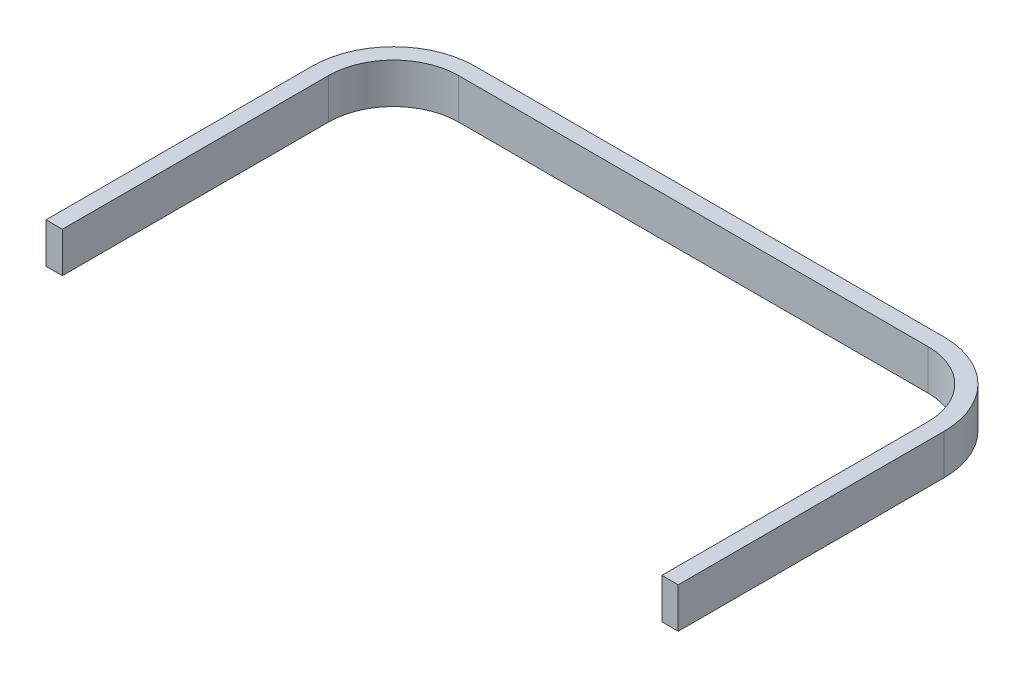
ISO-10303-21;
HEADER;
FILE_DESCRIPTION(('STEP AP214'),'2;1');
FILE_NAME('part.step','',(''),(''),'','','');
FILE_SCHEMA(('AUTOMOTIVE_DESIGN { 1 0 10303 214 1 1 1 1 }'));
ENDSEC;
DATA;
#1=APPLICATION_CONTEXT('core data for automotive mechanical design processes');
#2=APPLICATION_PROTOCOL_DEFINITION('international standard','automotive_design',2000,#1);
#3=PRODUCT_CONTEXT('',#1,'mechanical');
#4=PRODUCT('Part','Part','',(#3));
#5=PRODUCT_RELATED_PRODUCT_CATEGORY('part','',(#4));
#6=PRODUCT_DEFINITION_FORMATION('','',#4);
#7=PRODUCT_DEFINITION_CONTEXT('part definition',#1,'design');
#8=PRODUCT_DEFINITION('design','',#6,#7);
#9=PRODUCT_DEFINITION_SHAPE('','',#8);
#10=(LENGTH_UNIT() NAMED_UNIT(*) SI_UNIT(.MILLI.,.METRE.));
#11=(NAMED_UNIT(*) PLANE_ANGLE_UNIT() SI_UNIT($,.RADIAN.));
#12=(NAMED_UNIT(*) SI_UNIT($,.STERADIAN.) SOLID_ANGLE_UNIT());
#13=UNCERTAINTY_MEASURE_WITH_UNIT(LENGTH_MEASURE(1.E-05),#10,'distance_accuracy_value','');
#14=(GEOMETRIC_REPRESENTATION_CONTEXT(3) GLOBAL_UNCERTAINTY_ASSIGNED_CONTEXT((#13)) GLOBAL_UNIT_ASSIGNED_CONTEXT((#10,
#11,#12)) REPRESENTATION_CONTEXT('',''));
#15=CARTESIAN_POINT('',(0.,0.,0.));
#16=DIRECTION('',(0.,0.,1.));
#17=DIRECTION('',(1.,0.,0.));
#18=AXIS2_PLACEMENT_3D('',#15,#16,#17);
#19=CARTESIAN_POINT('',(-609.599999999999,-52.3075773788979,-784.073141203804));
#20=DIRECTION('',(0.,0.,1.));
#21=DIRECTION('',(1.,0.,0.));
#22=AXIS2_PLACEMENT_3D('',#19,#20,#21);
#23=PLANE('',#22);
#24=DIRECTION('',(0.,-1.,0.));
#25=VECTOR('',#24,1.);
#26=CARTESIAN_POINT('',(-609.599999999999,-52.3075773788979,-784.073141203804));
#27=LINE('',#26,#25);
#28=CARTESIAN_POINT('',(-609.599999999999,52.3075773788979,-784.073141203804));
#29=VERTEX_POINT('',#28);
#30=CARTESIAN_POINT('',(-609.599999999999,-52.3075773788979,-784.073141203804));
#31=VERTEX_POINT('',#30);
#32=EDGE_CURVE('E201',#29,#31,#27,.T.);
#33=ORIENTED_EDGE('',*,*,#32,.F.);
#34=DIRECTION('',(1.,0.,0.));
#35=VECTOR('',#34,1.);
#36=CARTESIAN_POINT('',(-609.599999999999,52.3075773788979,-784.073141203804));
#37=LINE('',#36,#35);
#38=CARTESIAN_POINT('',(609.60000000002,52.3075773788979,-784.073141203787));
#39=VERTEX_POINT('',#38);
#40=EDGE_CURVE('E217',#29,#39,#37,.T.);
#41=ORIENTED_EDGE('',*,*,#40,.T.);
#42=DIRECTION('',(0.,-1.,0.));
#43=VECTOR('',#42,1.);
#44=CARTESIAN_POINT('',(609.60000000002,-52.3075773788979,-784.073141203787));
#45=LINE('',#44,#43);
#46=CARTESIAN_POINT('',(609.60000000002,-52.3075773788979,-784.073141203787));
#47=VERTEX_POINT('',#46);
#48=EDGE_CURVE('E129',#39,#47,#45,.T.);
#49=ORIENTED_EDGE('',*,*,#48,.T.);
#50=DIRECTION('',(1.,0.,0.));
#51=VECTOR('',#50,1.);
#52=CARTESIAN_POINT('',(-609.599999999999,-52.3075773788979,-784.073141203804));
#53=LINE('',#52,#51);
#54=EDGE_CURVE('E40',#31,#47,#53,.T.);
#55=ORIENTED_EDGE('',*,*,#54,.F.);
#56=EDGE_LOOP('',(#33,#41,#49,#55));
#57=FACE_BOUND('',#56,.T.);
#58=ADVANCED_FACE('F33',(#57),#23,.F.);
#59=CARTESIAN_POINT('',(-609.599999999999,-52.3075773788979,-741.62523745539));
#60=DIRECTION('',(0.,0.,-1.));
#61=DIRECTION('',(-1.,0.,0.));
#62=AXIS2_PLACEMENT_3D('',#59,#60,#61);
#63=PLANE('',#62);
#64=DIRECTION('',(0.,1.,0.));
#65=VECTOR('',#64,1.);
#66=CARTESIAN_POINT('',(-609.599999999999,-52.3075773788979,-741.62523745539));
#67=LINE('',#66,#65);
#68=CARTESIAN_POINT('',(-609.599999999999,-52.3075773788979,-741.62523745539));
#69=VERTEX_POINT('',#68);
#70=CARTESIAN_POINT('',(-609.599999999999,52.3075773788979,-741.62523745539));
#71=VERTEX_POINT('',#70);
#72=EDGE_CURVE('E193',#69,#71,#67,.T.);
#73=ORIENTED_EDGE('',*,*,#72,.F.);
#74=DIRECTION('',(1.,0.,0.));
#75=VECTOR('',#74,1.);
#76=CARTESIAN_POINT('',(-609.599999999999,-52.3075773788979,-741.62523745539));
#77=LINE('',#76,#75);
#78=CARTESIAN_POINT('',(609.60000000002,-52.3075773788979,-741.625237455373));
#79=VERTEX_POINT('',#78);
#80=EDGE_CURVE('E11',#69,#79,#77,.T.);
#81=ORIENTED_EDGE('',*,*,#80,.T.);
#82=DIRECTION('',(0.,1.,0.));
#83=VECTOR('',#82,1.);
#84=CARTESIAN_POINT('',(609.60000000002,-52.3075773788979,-741.625237455373));
#85=LINE('',#84,#83);
#86=CARTESIAN_POINT('',(609.60000000002,52.3075773788979,-741.625237455373));
#87=VERTEX_POINT('',#86);
#88=EDGE_CURVE('E127',#79,#87,#85,.T.);
#89=ORIENTED_EDGE('',*,*,#88,.T.);
#90=DIRECTION('',(1.,0.,0.));
#91=VECTOR('',#90,1.);
#92=CARTESIAN_POINT('',(-609.599999999999,52.3075773788979,-741.62523745539));
#93=LINE('',#92,#91);
#94=EDGE_CURVE('E215',#71,#87,#93,.T.);
#95=ORIENTED_EDGE('',*,*,#94,.F.);
#96=EDGE_LOOP('',(#73,#81,#89,#95));
#97=FACE_BOUND('',#96,.T.);
#98=ADVANCED_FACE('F235',(#97),#63,.F.);
#99=CARTESIAN_POINT('',(-609.6,0.,-572.349189329597));
#100=DIRECTION('',(0.,-1.,0.));
#101=DIRECTION('',(0.,0.,-1.));
#102=AXIS2_PLACEMENT_3D('',#99,#100,#101);
#103=CYLINDRICAL_SURFACE('',#102,211.723951874206);
#104=DIRECTION('',(0.,-1.,0.));
#105=VECTOR('',#104,1.);
#106=CARTESIAN_POINT('',(-821.323951874207,-52.3075773788979,-572.349189329596));
#107=LINE('',#106,#105);
#108=CARTESIAN_POINT('',(-821.323951874207,52.3075773788979,-572.349189329596));
#109=VERTEX_POINT('',#108);
#110=CARTESIAN_POINT('',(-821.323951874207,-52.3075773788979,-572.349189329596));
#111=VERTEX_POINT('',#110);
#112=EDGE_CURVE('E176',#109,#111,#107,.T.);
#113=ORIENTED_EDGE('',*,*,#112,.F.);
#114=CARTESIAN_POINT('',(-609.6,52.3075773788979,-572.349189329597));
#115=DIRECTION('',(0.,-1.,0.));
#116=DIRECTION('',(0.,0.,-1.));
#117=AXIS2_PLACEMENT_3D('',#114,#115,#116);
#118=CIRCLE('',#117,211.723951874206);
#119=EDGE_CURVE('E206',#109,#29,#118,.T.);
#120=ORIENTED_EDGE('',*,*,#119,.T.);
#121=ORIENTED_EDGE('',*,*,#32,.T.);
#122=CARTESIAN_POINT('',(-609.6,-52.3075773788979,-572.349189329597));
#123=DIRECTION('',(0.,-1.,0.));
#124=DIRECTION('',(0.,0.,-1.));
#125=AXIS2_PLACEMENT_3D('',#122,#123,#124);
#126=CIRCLE('',#125,211.723951874206);
#127=EDGE_CURVE('E209',#111,#31,#126,.T.);
#128=ORIENTED_EDGE('',*,*,#127,.F.);
#129=EDGE_LOOP('',(#113,#120,#121,#128));
#130=FACE_BOUND('',#129,.T.);
#131=ADVANCED_FACE('F251',(#130),#103,.T.);
#132=CARTESIAN_POINT('',(-609.6,0.,-572.349189329597));
#133=DIRECTION('',(0.,-1.,0.));
#134=DIRECTION('',(0.,0.,-1.));
#135=AXIS2_PLACEMENT_3D('',#132,#133,#134);
#136=CYLINDRICAL_SURFACE('',#135,169.276048125793);
#137=DIRECTION('',(0.,1.,0.));
#138=VECTOR('',#137,1.);
#139=CARTESIAN_POINT('',(-778.876048125793,-52.3075773788979,-572.349189329596));
#140=LINE('',#139,#138);
#141=CARTESIAN_POINT('',(-778.876048125793,-52.3075773788979,-572.349189329596));
#142=VERTEX_POINT('',#141);
#143=CARTESIAN_POINT('',(-778.876048125793,52.3075773788979,-572.349189329596));
#144=VERTEX_POINT('',#143);
#145=EDGE_CURVE('E173',#142,#144,#140,.T.);
#146=ORIENTED_EDGE('',*,*,#145,.F.);
#147=CARTESIAN_POINT('',(-609.6,-52.3075773788979,-572.349189329597));
#148=DIRECTION('',(0.,-1.,0.));
#149=DIRECTION('',(0.,0.,-1.));
#150=AXIS2_PLACEMENT_3D('',#147,#148,#149);
#151=CIRCLE('',#150,169.276048125793);
#152=EDGE_CURVE('E212',#142,#69,#151,.T.);
#153=ORIENTED_EDGE('',*,*,#152,.T.);
#154=ORIENTED_EDGE('',*,*,#72,.T.);
#155=CARTESIAN_POINT('',(-609.6,52.3075773788979,-572.349189329597));
#156=DIRECTION('',(0.,-1.,0.));
#157=DIRECTION('',(0.,0.,-1.));
#158=AXIS2_PLACEMENT_3D('',#155,#156,#157);
#159=CIRCLE('',#158,169.276048125793);
#160=EDGE_CURVE('E203',#144,#71,#159,.T.);
#161=ORIENTED_EDGE('',*,*,#160,.F.);
#162=EDGE_LOOP('',(#146,#153,#154,#161));
#163=FACE_BOUND('',#162,.T.);
#164=ADVANCED_FACE('F238',(#163),#136,.F.);
#165=CARTESIAN_POINT('',(-778.876048125793,-52.3075773788979,-572.349189329596));
#166=DIRECTION('',(1.,0.,0.));
#167=DIRECTION('',(0.,0.,-1.));
#168=AXIS2_PLACEMENT_3D('',#165,#166,#167);
#169=PLANE('',#168);
#170=DIRECTION('',(0.,1.,0.));
#171=VECTOR('',#170,1.);
#172=CARTESIAN_POINT('',(-778.876048125793,-52.3075773788979,118.94796794434));
#173=LINE('',#172,#171);
#174=CARTESIAN_POINT('',(-778.876048125793,-52.3075773788979,118.94796794434));
#175=VERTEX_POINT('',#174);
#176=CARTESIAN_POINT('',(-778.876048125793,52.3075773788979,118.94796794434));
#177=VERTEX_POINT('',#176);
#178=EDGE_CURVE('E172',#175,#177,#173,.T.);
#179=ORIENTED_EDGE('',*,*,#178,.F.);
#180=DIRECTION('',(0.,0.,1.));
#181=VECTOR('',#180,1.);
#182=CARTESIAN_POINT('',(-778.876048125793,-52.3075773788979,-572.349189329596));
#183=LINE('',#182,#181);
#184=EDGE_CURVE('E191',#142,#175,#183,.T.);
#185=ORIENTED_EDGE('',*,*,#184,.F.);
#186=ORIENTED_EDGE('',*,*,#145,.T.);
#187=DIRECTION('',(0.,0.,1.));
#188=VECTOR('',#187,1.);
#189=CARTESIAN_POINT('',(-778.876048125793,52.3075773788979,-572.349189329596));
#190=LINE('',#189,#188);
#191=EDGE_CURVE('E180',#144,#177,#190,.T.);
#192=ORIENTED_EDGE('',*,*,#191,.T.);
#193=EDGE_LOOP('',(#179,#185,#186,#192));
#194=FACE_BOUND('',#193,.T.);
#195=ADVANCED_FACE('F242',(#194),#169,.T.);
#196=CARTESIAN_POINT('',(-821.323951874207,-52.3075773788979,-572.349189329596));
#197=DIRECTION('',(0.,-1.,0.));
#198=DIRECTION('',(0.,0.,-1.));
#199=AXIS2_PLACEMENT_3D('',#196,#197,#198);
#200=PLANE('',#199);
#201=DIRECTION('',(1.,0.,0.));
#202=VECTOR('',#201,1.);
#203=CARTESIAN_POINT('',(-821.323951874207,-52.3075773788979,118.94796794434));
#204=LINE('',#203,#202);
#205=CARTESIAN_POINT('',(-821.323951874207,-52.3075773788979,118.94796794434));
#206=VERTEX_POINT('',#205);
#207=EDGE_CURVE('E177',#206,#175,#204,.T.);
#208=ORIENTED_EDGE('',*,*,#207,.F.);
#209=DIRECTION('',(0.,0.,1.));
#210=VECTOR('',#209,1.);
#211=CARTESIAN_POINT('',(-821.323951874207,-52.3075773788979,-572.349189329596));
#212=LINE('',#211,#210);
#213=EDGE_CURVE('E194',#111,#206,#212,.T.);
#214=ORIENTED_EDGE('',*,*,#213,.F.);
#215=ORIENTED_EDGE('',*,*,#127,.T.);
#216=ORIENTED_EDGE('',*,*,#54,.T.);
#217=CARTESIAN_POINT('',(609.600000000016,-52.3075773788979,-572.34918932958));
#218=DIRECTION('',(0.,1.,0.));
#219=DIRECTION('',(0.,0.,1.));
#220=AXIS2_PLACEMENT_3D('',#217,#218,#219);
#221=CIRCLE('',#220,211.723951874206);
#222=CARTESIAN_POINT('',(821.323951874223,-52.3075773788979,-572.349189329573));
#223=VERTEX_POINT('',#222);
#224=EDGE_CURVE('E128',#223,#47,#221,.T.);
#225=ORIENTED_EDGE('',*,*,#224,.F.);
#226=DIRECTION('',(0.,0.,1.));
#227=VECTOR('',#226,1.);
#228=CARTESIAN_POINT('',(821.323951874223,-52.3075773788979,-572.349189329573));
#229=LINE('',#228,#227);
#230=CARTESIAN_POINT('',(821.323951874203,-52.3075773788979,118.947967944363));
#231=VERTEX_POINT('',#230);
#232=EDGE_CURVE('E141',#223,#231,#229,.T.);
#233=ORIENTED_EDGE('',*,*,#232,.T.);
#234=DIRECTION('',(-1.,0.,0.));
#235=VECTOR('',#234,1.);
#236=CARTESIAN_POINT('',(821.323951874203,-52.3075773788979,118.947967944363));
#237=LINE('',#236,#235);
#238=CARTESIAN_POINT('',(778.87604812579,-52.3075773788979,118.947967944362));
#239=VERTEX_POINT('',#238);
#240=EDGE_CURVE('E137',#231,#239,#237,.T.);
#241=ORIENTED_EDGE('',*,*,#240,.T.);
#242=DIRECTION('',(0.,0.,1.));
#243=VECTOR('',#242,1.);
#244=CARTESIAN_POINT('',(778.876048125809,-52.3075773788979,-572.349189329574));
#245=LINE('',#244,#243);
#246=CARTESIAN_POINT('',(778.876048125809,-52.3075773788979,-572.349189329574));
#247=VERTEX_POINT('',#246);
#248=EDGE_CURVE('E132',#247,#239,#245,.T.);
#249=ORIENTED_EDGE('',*,*,#248,.F.);
#250=CARTESIAN_POINT('',(609.600000000016,-52.3075773788979,-572.34918932958));
#251=DIRECTION('',(0.,1.,0.));
#252=DIRECTION('',(0.,0.,1.));
#253=AXIS2_PLACEMENT_3D('',#250,#251,#252);
#254=CIRCLE('',#253,169.276048125793);
#255=EDGE_CURVE('E119',#247,#79,#254,.T.);
#256=ORIENTED_EDGE('',*,*,#255,.T.);
#257=ORIENTED_EDGE('',*,*,#80,.F.);
#258=ORIENTED_EDGE('',*,*,#152,.F.);
#259=ORIENTED_EDGE('',*,*,#184,.T.);
#260=EDGE_LOOP('',(#208,#214,#215,#216,#225,#233,#241,#249,#256,#257,#258,#259));
#261=FACE_BOUND('',#260,.T.);
#262=ADVANCED_FACE('F134',(#261),#200,.T.);
#263=CARTESIAN_POINT('',(-821.323951874207,-52.3075773788979,-572.349189329596));
#264=DIRECTION('',(-1.,0.,0.));
#265=DIRECTION('',(0.,0.,1.));
#266=AXIS2_PLACEMENT_3D('',#263,#264,#265);
#267=PLANE('',#266);
#268=DIRECTION('',(0.,-1.,0.));
#269=VECTOR('',#268,1.);
#270=CARTESIAN_POINT('',(-821.323951874207,-52.3075773788979,118.94796794434));
#271=LINE('',#270,#269);
#272=CARTESIAN_POINT('',(-821.323951874207,52.3075773788979,118.94796794434));
#273=VERTEX_POINT('',#272);
#274=EDGE_CURVE('E186',#273,#206,#271,.T.);
#275=ORIENTED_EDGE('',*,*,#274,.F.);
#276=DIRECTION('',(0.,0.,1.));
#277=VECTOR('',#276,1.);
#278=CARTESIAN_POINT('',(-821.323951874207,52.3075773788979,-572.349189329596));
#279=LINE('',#278,#277);
#280=EDGE_CURVE('E196',#109,#273,#279,.T.);
#281=ORIENTED_EDGE('',*,*,#280,.F.);
#282=ORIENTED_EDGE('',*,*,#112,.T.);
#283=ORIENTED_EDGE('',*,*,#213,.T.);
#284=EDGE_LOOP('',(#275,#281,#282,#283));
#285=FACE_BOUND('',#284,.T.);
#286=ADVANCED_FACE('F248',(#285),#267,.T.);
#287=CARTESIAN_POINT('',(-821.323951874207,52.3075773788979,-572.349189329596));
#288=DIRECTION('',(0.,1.,0.));
#289=DIRECTION('',(0.,0.,1.));
#290=AXIS2_PLACEMENT_3D('',#287,#288,#289);
#291=PLANE('',#290);
#292=DIRECTION('',(-1.,0.,0.));
#293=VECTOR('',#292,1.);
#294=CARTESIAN_POINT('',(-821.323951874207,52.3075773788979,118.94796794434));
#295=LINE('',#294,#293);
#296=EDGE_CURVE('E183',#177,#273,#295,.T.);
#297=ORIENTED_EDGE('',*,*,#296,.F.);
#298=ORIENTED_EDGE('',*,*,#191,.F.);
#299=ORIENTED_EDGE('',*,*,#160,.T.);
#300=ORIENTED_EDGE('',*,*,#94,.T.);
#301=CARTESIAN_POINT('',(609.600000000016,52.3075773788979,-572.34918932958));
#302=DIRECTION('',(0.,1.,0.));
#303=DIRECTION('',(0.,0.,1.));
#304=AXIS2_PLACEMENT_3D('',#301,#302,#303);
#305=CIRCLE('',#304,169.276048125793);
#306=CARTESIAN_POINT('',(778.876048125809,52.3075773788979,-572.349189329574));
#307=VERTEX_POINT('',#306);
#308=EDGE_CURVE('E170',#307,#87,#305,.T.);
#309=ORIENTED_EDGE('',*,*,#308,.F.);
#310=DIRECTION('',(0.,0.,1.));
#311=VECTOR('',#310,1.);
#312=CARTESIAN_POINT('',(778.876048125809,52.3075773788979,-572.349189329574));
#313=LINE('',#312,#311);
#314=CARTESIAN_POINT('',(778.87604812579,52.3075773788979,118.947967944362));
#315=VERTEX_POINT('',#314);
#316=EDGE_CURVE('E146',#307,#315,#313,.T.);
#317=ORIENTED_EDGE('',*,*,#316,.T.);
#318=DIRECTION('',(1.,0.,0.));
#319=VECTOR('',#318,1.);
#320=CARTESIAN_POINT('',(821.323951874203,52.3075773788979,118.947967944363));
#321=LINE('',#320,#319);
#322=CARTESIAN_POINT('',(821.323951874203,52.3075773788979,118.947967944363));
#323=VERTEX_POINT('',#322);
#324=EDGE_CURVE('E147',#315,#323,#321,.T.);
#325=ORIENTED_EDGE('',*,*,#324,.T.);
#326=DIRECTION('',(0.,0.,1.));
#327=VECTOR('',#326,1.);
#328=CARTESIAN_POINT('',(821.323951874223,52.3075773788979,-572.349189329573));
#329=LINE('',#328,#327);
#330=CARTESIAN_POINT('',(821.323951874223,52.3075773788979,-572.349189329573));
#331=VERTEX_POINT('',#330);
#332=EDGE_CURVE('E159',#331,#323,#329,.T.);
#333=ORIENTED_EDGE('',*,*,#332,.F.);
#334=CARTESIAN_POINT('',(609.600000000016,52.3075773788979,-572.34918932958));
#335=DIRECTION('',(0.,1.,0.));
#336=DIRECTION('',(0.,0.,1.));
#337=AXIS2_PLACEMENT_3D('',#334,#335,#336);
#338=CIRCLE('',#337,211.723951874206);
#339=EDGE_CURVE('E167',#331,#39,#338,.T.);
#340=ORIENTED_EDGE('',*,*,#339,.T.);
#341=ORIENTED_EDGE('',*,*,#40,.F.);
#342=ORIENTED_EDGE('',*,*,#119,.F.);
#343=ORIENTED_EDGE('',*,*,#280,.T.);
#344=EDGE_LOOP('',(#297,#298,#299,#300,#309,#317,#325,#333,#340,#341,#342,#343));
#345=FACE_BOUND('',#344,.T.);
#346=ADVANCED_FACE('F232',(#345),#291,.T.);
#347=CARTESIAN_POINT('',(0.,0.,118.94796794434));
#348=DIRECTION('',(0.,0.,-1.));
#349=DIRECTION('',(-1.,0.,0.));
#350=AXIS2_PLACEMENT_3D('',#347,#348,#349);
#351=PLANE('',#350);
#352=ORIENTED_EDGE('',*,*,#178,.T.);
#353=ORIENTED_EDGE('',*,*,#296,.T.);
#354=ORIENTED_EDGE('',*,*,#274,.T.);
#355=ORIENTED_EDGE('',*,*,#207,.T.);
#356=EDGE_LOOP('',(#352,#353,#354,#355));
#357=FACE_BOUND('',#356,.T.);
#358=ADVANCED_FACE('F244',(#357),#351,.F.);
#359=CARTESIAN_POINT('',(609.600000000016,0.,-572.34918932958));
#360=DIRECTION('',(0.,1.,0.));
#361=DIRECTION('',(0.,0.,1.));
#362=AXIS2_PLACEMENT_3D('',#359,#360,#361);
#363=CYLINDRICAL_SURFACE('',#362,211.723951874206);
#364=DIRECTION('',(0.,-1.,0.));
#365=VECTOR('',#364,1.);
#366=CARTESIAN_POINT('',(821.323951874223,-52.3075773788979,-572.349189329573));
#367=LINE('',#366,#365);
#368=EDGE_CURVE('E142',#331,#223,#367,.T.);
#369=ORIENTED_EDGE('',*,*,#368,.T.);
#370=ORIENTED_EDGE('',*,*,#224,.T.);
#371=ORIENTED_EDGE('',*,*,#48,.F.);
#372=ORIENTED_EDGE('',*,*,#339,.F.);
#373=EDGE_LOOP('',(#369,#370,#371,#372));
#374=FACE_BOUND('',#373,.T.);
#375=ADVANCED_FACE('F221',(#374),#363,.T.);
#376=CARTESIAN_POINT('',(609.600000000016,0.,-572.34918932958));
#377=DIRECTION('',(0.,1.,0.));
#378=DIRECTION('',(0.,0.,1.));
#379=AXIS2_PLACEMENT_3D('',#376,#377,#378);
#380=CYLINDRICAL_SURFACE('',#379,169.276048125793);
#381=DIRECTION('',(0.,1.,0.));
#382=VECTOR('',#381,1.);
#383=CARTESIAN_POINT('',(778.876048125809,-52.3075773788979,-572.349189329574));
#384=LINE('',#383,#382);
#385=EDGE_CURVE('E124',#247,#307,#384,.T.);
#386=ORIENTED_EDGE('',*,*,#385,.T.);
#387=ORIENTED_EDGE('',*,*,#308,.T.);
#388=ORIENTED_EDGE('',*,*,#88,.F.);
#389=ORIENTED_EDGE('',*,*,#255,.F.);
#390=EDGE_LOOP('',(#386,#387,#388,#389));
#391=FACE_BOUND('',#390,.T.);
#392=ADVANCED_FACE('F121',(#391),#380,.F.);
#393=CARTESIAN_POINT('',(778.876048125809,-52.3075773788979,-572.349189329574));
#394=DIRECTION('',(1.,0.,0.));
#395=DIRECTION('',(0.,0.,-1.));
#396=AXIS2_PLACEMENT_3D('',#393,#394,#395);
#397=PLANE('',#396);
#398=DIRECTION('',(0.,1.,0.));
#399=VECTOR('',#398,1.);
#400=CARTESIAN_POINT('',(778.87604812579,-52.3075773788979,118.947967944362));
#401=LINE('',#400,#399);
#402=EDGE_CURVE('E154',#239,#315,#401,.T.);
#403=ORIENTED_EDGE('',*,*,#402,.T.);
#404=ORIENTED_EDGE('',*,*,#316,.F.);
#405=ORIENTED_EDGE('',*,*,#385,.F.);
#406=ORIENTED_EDGE('',*,*,#248,.T.);
#407=EDGE_LOOP('',(#403,#404,#405,#406));
#408=FACE_BOUND('',#407,.T.);
#409=ADVANCED_FACE('F144',(#408),#397,.F.);
#410=CARTESIAN_POINT('',(821.323951874223,-52.3075773788979,-572.349189329573));
#411=DIRECTION('',(-1.,0.,0.));
#412=DIRECTION('',(0.,0.,1.));
#413=AXIS2_PLACEMENT_3D('',#410,#411,#412);
#414=PLANE('',#413);
#415=DIRECTION('',(0.,-1.,0.));
#416=VECTOR('',#415,1.);
#417=CARTESIAN_POINT('',(821.323951874203,-52.3075773788979,118.947967944363));
#418=LINE('',#417,#416);
#419=EDGE_CURVE('E151',#323,#231,#418,.T.);
#420=ORIENTED_EDGE('',*,*,#419,.T.);
#421=ORIENTED_EDGE('',*,*,#232,.F.);
#422=ORIENTED_EDGE('',*,*,#368,.F.);
#423=ORIENTED_EDGE('',*,*,#332,.T.);
#424=EDGE_LOOP('',(#420,#421,#422,#423));
#425=FACE_BOUND('',#424,.T.);
#426=ADVANCED_FACE('F226',(#425),#414,.F.);
#427=CARTESIAN_POINT('',(-3.31331414833257E-12,0.,118.94796794434));
#428=DIRECTION('',(0.,0.,-1.));
#429=DIRECTION('',(1.,0.,0.));
#430=AXIS2_PLACEMENT_3D('',#427,#428,#429);
#431=PLANE('',#430);
#432=ORIENTED_EDGE('',*,*,#402,.F.);
#433=ORIENTED_EDGE('',*,*,#240,.F.);
#434=ORIENTED_EDGE('',*,*,#419,.F.);
#435=ORIENTED_EDGE('',*,*,#324,.F.);
#436=EDGE_LOOP('',(#432,#433,#434,#435));
#437=FACE_BOUND('',#436,.T.);
#438=ADVANCED_FACE('F229',(#437),#431,.F.);
#439=CLOSED_SHELL('',(#58,#98,#131,#164,#195,#262,#286,#346,#358,#375,#392,#409,#426,#438));
#440=MANIFOLD_SOLID_BREP('B2',#439);
#441=ADVANCED_BREP_SHAPE_REPRESENTATION('',(#18,#440),#14);
#442=SHAPE_DEFINITION_REPRESENTATION(#9,#441);
ENDSEC;
END-ISO-10303-21;
